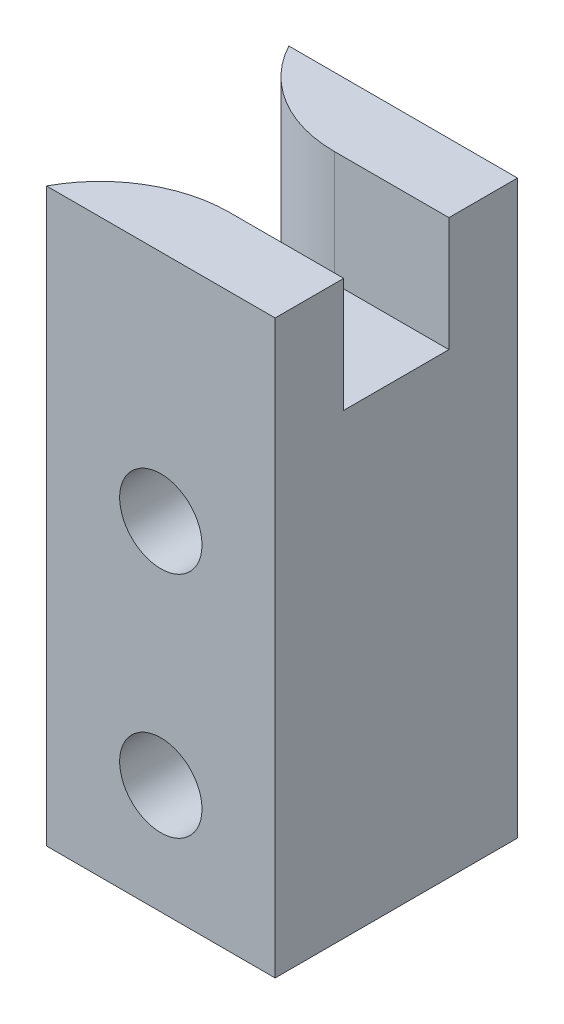
ISO-10303-21;
HEADER;
FILE_DESCRIPTION(('STEP AP214'),'2;1');
FILE_NAME('part.step','',(''),(''),'','','');
FILE_SCHEMA(('AUTOMOTIVE_DESIGN { 1 0 10303 214 1 1 1 1 }'));
ENDSEC;
DATA;
#1=APPLICATION_CONTEXT('core data for automotive mechanical design processes');
#2=APPLICATION_PROTOCOL_DEFINITION('international standard','automotive_design',2000,#1);
#3=PRODUCT_CONTEXT('',#1,'mechanical');
#4=PRODUCT('Part','Part','',(#3));
#5=PRODUCT_RELATED_PRODUCT_CATEGORY('part','',(#4));
#6=PRODUCT_DEFINITION_FORMATION('','',#4);
#7=PRODUCT_DEFINITION_CONTEXT('part definition',#1,'design');
#8=PRODUCT_DEFINITION('design','',#6,#7);
#9=PRODUCT_DEFINITION_SHAPE('','',#8);
#10=(LENGTH_UNIT() NAMED_UNIT(*) SI_UNIT(.MILLI.,.METRE.));
#11=(NAMED_UNIT(*) PLANE_ANGLE_UNIT() SI_UNIT($,.RADIAN.));
#12=(NAMED_UNIT(*) SI_UNIT($,.STERADIAN.) SOLID_ANGLE_UNIT());
#13=UNCERTAINTY_MEASURE_WITH_UNIT(LENGTH_MEASURE(1.E-05),#10,'distance_accuracy_value','');
#14=(GEOMETRIC_REPRESENTATION_CONTEXT(3) GLOBAL_UNCERTAINTY_ASSIGNED_CONTEXT((#13)) GLOBAL_UNIT_ASSIGNED_CONTEXT((#10,
#11,#12)) REPRESENTATION_CONTEXT('',''));
#15=CARTESIAN_POINT('',(0.,0.,0.));
#16=DIRECTION('',(0.,0.,1.));
#17=DIRECTION('',(1.,0.,0.));
#18=AXIS2_PLACEMENT_3D('',#15,#16,#17);
#19=CARTESIAN_POINT('',(0.,20.,0.));
#20=DIRECTION('',(0.,-1.,0.));
#21=DIRECTION('',(0.,0.,-1.));
#22=AXIS2_PLACEMENT_3D('',#19,#20,#21);
#23=PLANE('',#22);
#24=DIRECTION('',(-1.,0.,0.));
#25=VECTOR('',#24,1.);
#26=CARTESIAN_POINT('',(10.,20.,-3.));
#27=LINE('',#26,#25);
#28=CARTESIAN_POINT('',(10.,20.,-3.));
#29=VERTEX_POINT('',#28);
#30=CARTESIAN_POINT('',(5.,20.,-3.));
#31=VERTEX_POINT('',#30);
#32=EDGE_CURVE('E127',#29,#31,#27,.T.);
#33=ORIENTED_EDGE('',*,*,#32,.F.);
#34=DIRECTION('',(0.,0.,-1.));
#35=VECTOR('',#34,1.);
#36=CARTESIAN_POINT('',(10.,20.,0.));
#37=LINE('',#36,#35);
#38=CARTESIAN_POINT('',(10.,20.,-7.6));
#39=VERTEX_POINT('',#38);
#40=EDGE_CURVE('E183',#29,#39,#37,.T.);
#41=ORIENTED_EDGE('',*,*,#40,.T.);
#42=DIRECTION('',(1.,0.,0.));
#43=VECTOR('',#42,1.);
#44=CARTESIAN_POINT('',(5.,20.,-7.6));
#45=LINE('',#44,#43);
#46=CARTESIAN_POINT('',(5.,20.,-7.6));
#47=VERTEX_POINT('',#46);
#48=EDGE_CURVE('E145',#47,#39,#45,.T.);
#49=ORIENTED_EDGE('',*,*,#48,.F.);
#50=DIRECTION('',(0.,0.,1.));
#51=VECTOR('',#50,1.);
#52=CARTESIAN_POINT('',(5.,20.,-10.6));
#53=LINE('',#52,#51);
#54=EDGE_CURVE('E175',#47,#31,#53,.T.);
#55=ORIENTED_EDGE('',*,*,#54,.T.);
#56=EDGE_LOOP('',(#33,#41,#49,#55));
#57=FACE_BOUND('',#56,.T.);
#58=ADVANCED_FACE('F32',(#57),#23,.F.);
#59=CARTESIAN_POINT('',(0.,20.,0.));
#60=DIRECTION('',(1.,0.,0.));
#61=DIRECTION('',(0.,0.,-1.));
#62=AXIS2_PLACEMENT_3D('',#59,#60,#61);
#63=PLANE('',#62);
#64=DIRECTION('',(0.,-1.,0.));
#65=VECTOR('',#64,1.);
#66=CARTESIAN_POINT('',(0.,20.,0.));
#67=LINE('',#66,#65);
#68=CARTESIAN_POINT('',(0.,17.3166247903554,0.));
#69=VERTEX_POINT('',#68);
#70=CARTESIAN_POINT('',(0.,0.,0.));
#71=VERTEX_POINT('',#70);
#72=EDGE_CURVE('E11',#69,#71,#67,.T.);
#73=ORIENTED_EDGE('',*,*,#72,.F.);
#74=DIRECTION('',(0.,0.,1.));
#75=VECTOR('',#74,1.);
#76=CARTESIAN_POINT('',(0.,17.3166247903554,-10.6));
#77=LINE('',#76,#75);
#78=CARTESIAN_POINT('',(0.,17.3166247903654,-10.6));
#79=VERTEX_POINT('',#78);
#80=EDGE_CURVE('E178',#79,#69,#77,.T.);
#81=ORIENTED_EDGE('',*,*,#80,.F.);
#82=DIRECTION('',(0.,-1.,0.));
#83=VECTOR('',#82,1.);
#84=CARTESIAN_POINT('',(0.,20.,-10.6));
#85=LINE('',#84,#83);
#86=CARTESIAN_POINT('',(0.,0.,-10.6));
#87=VERTEX_POINT('',#86);
#88=EDGE_CURVE('E57',#79,#87,#85,.T.);
#89=ORIENTED_EDGE('',*,*,#88,.T.);
#90=DIRECTION('',(0.,0.,1.));
#91=VECTOR('',#90,1.);
#92=CARTESIAN_POINT('',(0.,0.,0.));
#93=LINE('',#92,#91);
#94=EDGE_CURVE('E180',#87,#71,#93,.T.);
#95=ORIENTED_EDGE('',*,*,#94,.T.);
#96=EDGE_LOOP('',(#73,#81,#89,#95));
#97=FACE_BOUND('',#96,.T.);
#98=ADVANCED_FACE('F34',(#97),#63,.F.);
#99=CARTESIAN_POINT('',(0.,20.,0.));
#100=DIRECTION('',(0.,0.,-1.));
#101=DIRECTION('',(-1.,0.,0.));
#102=AXIS2_PLACEMENT_3D('',#99,#100,#101);
#103=PLANE('',#102);
#104=CARTESIAN_POINT('',(5.,4.8,0.));
#105=DIRECTION('',(0.,0.,1.));
#106=DIRECTION('',(1.,0.,0.));
#107=AXIS2_PLACEMENT_3D('',#104,#105,#106);
#108=CIRCLE('',#107,1.8);
#109=CARTESIAN_POINT('',(6.8,4.8,0.));
#110=VERTEX_POINT('',#109);
#111=EDGE_CURVE('E203',#110,#110,#108,.T.);
#112=ORIENTED_EDGE('',*,*,#111,.F.);
#113=EDGE_LOOP('',(#112));
#114=FACE_BOUND('',#113,.T.);
#115=CARTESIAN_POINT('',(5.,14.8,0.));
#116=DIRECTION('',(0.,0.,1.));
#117=DIRECTION('',(1.,0.,0.));
#118=AXIS2_PLACEMENT_3D('',#115,#116,#117);
#119=CIRCLE('',#118,1.8);
#120=CARTESIAN_POINT('',(6.8,14.8,0.));
#121=VERTEX_POINT('',#120);
#122=EDGE_CURVE('E132',#121,#121,#119,.T.);
#123=ORIENTED_EDGE('',*,*,#122,.F.);
#124=EDGE_LOOP('',(#123));
#125=FACE_BOUND('',#124,.T.);
#126=DIRECTION('',(0.,-1.,0.));
#127=VECTOR('',#126,1.);
#128=CARTESIAN_POINT('',(10.,20.,0.));
#129=LINE('',#128,#127);
#130=CARTESIAN_POINT('',(10.,25.,0.));
#131=VERTEX_POINT('',#130);
#132=CARTESIAN_POINT('',(10.,0.,0.));
#133=VERTEX_POINT('',#132);
#134=EDGE_CURVE('E41',#131,#133,#129,.T.);
#135=ORIENTED_EDGE('',*,*,#134,.F.);
#136=DIRECTION('',(1.,0.,0.));
#137=VECTOR('',#136,1.);
#138=CARTESIAN_POINT('',(0.,25.,0.));
#139=LINE('',#138,#137);
#140=CARTESIAN_POINT('',(0.,25.,0.));
#141=VERTEX_POINT('',#140);
#142=EDGE_CURVE('E117',#141,#131,#139,.T.);
#143=ORIENTED_EDGE('',*,*,#142,.F.);
#144=DIRECTION('',(0.,1.,0.));
#145=VECTOR('',#144,1.);
#146=CARTESIAN_POINT('',(0.,-500000.,0.));
#147=LINE('',#146,#145);
#148=EDGE_CURVE('E105',#69,#141,#147,.T.);
#149=ORIENTED_EDGE('',*,*,#148,.F.);
#150=ORIENTED_EDGE('',*,*,#72,.T.);
#151=DIRECTION('',(1.,0.,0.));
#152=VECTOR('',#151,1.);
#153=CARTESIAN_POINT('',(0.,0.,0.));
#154=LINE('',#153,#152);
#155=EDGE_CURVE('E187',#71,#133,#154,.T.);
#156=ORIENTED_EDGE('',*,*,#155,.T.);
#157=EDGE_LOOP('',(#135,#143,#149,#150,#156));
#158=FACE_BOUND('',#157,.T.);
#159=ADVANCED_FACE('F118',(#114,#125,#158),#103,.F.);
#160=CARTESIAN_POINT('',(10.,20.,0.));
#161=DIRECTION('',(-1.,0.,0.));
#162=DIRECTION('',(0.,0.,1.));
#163=AXIS2_PLACEMENT_3D('',#160,#161,#162);
#164=PLANE('',#163);
#165=DIRECTION('',(0.,0.,-1.));
#166=VECTOR('',#165,1.);
#167=CARTESIAN_POINT('',(10.,0.,0.));
#168=LINE('',#167,#166);
#169=CARTESIAN_POINT('',(10.,0.,-10.6));
#170=VERTEX_POINT('',#169);
#171=EDGE_CURVE('E189',#133,#170,#168,.T.);
#172=ORIENTED_EDGE('',*,*,#171,.T.);
#173=DIRECTION('',(0.,-1.,0.));
#174=VECTOR('',#173,1.);
#175=CARTESIAN_POINT('',(10.,20.,-10.6));
#176=LINE('',#175,#174);
#177=CARTESIAN_POINT('',(10.,25.,-10.6));
#178=VERTEX_POINT('',#177);
#179=EDGE_CURVE('E193',#178,#170,#176,.T.);
#180=ORIENTED_EDGE('',*,*,#179,.F.);
#181=DIRECTION('',(0.,0.,-1.));
#182=VECTOR('',#181,1.);
#183=CARTESIAN_POINT('',(10.,25.,-7.6));
#184=LINE('',#183,#182);
#185=CARTESIAN_POINT('',(10.,25.,-7.6));
#186=VERTEX_POINT('',#185);
#187=EDGE_CURVE('E146',#186,#178,#184,.T.);
#188=ORIENTED_EDGE('',*,*,#187,.F.);
#189=DIRECTION('',(0.,-1.,0.));
#190=VECTOR('',#189,1.);
#191=CARTESIAN_POINT('',(10.,25.,-7.6));
#192=LINE('',#191,#190);
#193=EDGE_CURVE('E263',#186,#39,#192,.T.);
#194=ORIENTED_EDGE('',*,*,#193,.T.);
#195=ORIENTED_EDGE('',*,*,#40,.F.);
#196=DIRECTION('',(0.,-1.,0.));
#197=VECTOR('',#196,1.);
#198=CARTESIAN_POINT('',(10.,25.,-3.));
#199=LINE('',#198,#197);
#200=CARTESIAN_POINT('',(10.,25.,-3.));
#201=VERTEX_POINT('',#200);
#202=EDGE_CURVE('E114',#201,#29,#199,.T.);
#203=ORIENTED_EDGE('',*,*,#202,.F.);
#204=DIRECTION('',(0.,0.,-1.));
#205=VECTOR('',#204,1.);
#206=CARTESIAN_POINT('',(10.,25.,0.));
#207=LINE('',#206,#205);
#208=EDGE_CURVE('E122',#131,#201,#207,.T.);
#209=ORIENTED_EDGE('',*,*,#208,.F.);
#210=ORIENTED_EDGE('',*,*,#134,.T.);
#211=EDGE_LOOP('',(#172,#180,#188,#194,#195,#203,#209,#210));
#212=FACE_BOUND('',#211,.T.);
#213=ADVANCED_FACE('F214',(#212),#164,.F.);
#214=CARTESIAN_POINT('',(0.,20.,-10.6));
#215=DIRECTION('',(0.,0.,1.));
#216=DIRECTION('',(1.,0.,0.));
#217=AXIS2_PLACEMENT_3D('',#214,#215,#216);
#218=PLANE('',#217);
#219=CARTESIAN_POINT('',(5.,4.8,-10.6));
#220=DIRECTION('',(0.,0.,1.));
#221=DIRECTION('',(1.,0.,0.));
#222=AXIS2_PLACEMENT_3D('',#219,#220,#221);
#223=CIRCLE('',#222,1.8);
#224=CARTESIAN_POINT('',(6.8,4.8,-10.6));
#225=VERTEX_POINT('',#224);
#226=EDGE_CURVE('E36',#225,#225,#223,.T.);
#227=ORIENTED_EDGE('',*,*,#226,.T.);
#228=EDGE_LOOP('',(#227));
#229=FACE_BOUND('',#228,.T.);
#230=CARTESIAN_POINT('',(5.,14.8,-10.6));
#231=DIRECTION('',(0.,0.,1.));
#232=DIRECTION('',(1.,0.,0.));
#233=AXIS2_PLACEMENT_3D('',#230,#231,#232);
#234=CIRCLE('',#233,1.8);
#235=CARTESIAN_POINT('',(6.8,14.8,-10.6));
#236=VERTEX_POINT('',#235);
#237=EDGE_CURVE('E129',#236,#236,#234,.T.);
#238=ORIENTED_EDGE('',*,*,#237,.T.);
#239=EDGE_LOOP('',(#238));
#240=FACE_BOUND('',#239,.T.);
#241=ORIENTED_EDGE('',*,*,#88,.F.);
#242=DIRECTION('',(0.,1.,0.));
#243=VECTOR('',#242,1.);
#244=CARTESIAN_POINT('',(0.,-500000.,-10.6));
#245=LINE('',#244,#243);
#246=CARTESIAN_POINT('',(0.,25.,-10.6));
#247=VERTEX_POINT('',#246);
#248=EDGE_CURVE('E176',#79,#247,#245,.T.);
#249=ORIENTED_EDGE('',*,*,#248,.T.);
#250=DIRECTION('',(-1.,0.,0.));
#251=VECTOR('',#250,1.);
#252=CARTESIAN_POINT('',(10.,25.,-10.6));
#253=LINE('',#252,#251);
#254=EDGE_CURVE('E258',#178,#247,#253,.T.);
#255=ORIENTED_EDGE('',*,*,#254,.F.);
#256=ORIENTED_EDGE('',*,*,#179,.T.);
#257=DIRECTION('',(-1.,0.,0.));
#258=VECTOR('',#257,1.);
#259=CARTESIAN_POINT('',(0.,0.,-10.6));
#260=LINE('',#259,#258);
#261=EDGE_CURVE('E185',#170,#87,#260,.T.);
#262=ORIENTED_EDGE('',*,*,#261,.T.);
#263=EDGE_LOOP('',(#241,#249,#255,#256,#262));
#264=FACE_BOUND('',#263,.T.);
#265=ADVANCED_FACE('F219',(#229,#240,#264),#218,.F.);
#266=CARTESIAN_POINT('',(0.,0.,0.));
#267=DIRECTION('',(0.,-1.,0.));
#268=DIRECTION('',(0.,0.,-1.));
#269=AXIS2_PLACEMENT_3D('',#266,#267,#268);
#270=PLANE('',#269);
#271=ORIENTED_EDGE('',*,*,#94,.F.);
#272=ORIENTED_EDGE('',*,*,#261,.F.);
#273=ORIENTED_EDGE('',*,*,#171,.F.);
#274=ORIENTED_EDGE('',*,*,#155,.F.);
#275=EDGE_LOOP('',(#271,#272,#273,#274));
#276=FACE_BOUND('',#275,.T.);
#277=ADVANCED_FACE('F229',(#276),#270,.T.);
#278=CARTESIAN_POINT('',(5.,14.,-10.6));
#279=DIRECTION('',(0.,0.,1.));
#280=DIRECTION('',(1.,0.,0.));
#281=AXIS2_PLACEMENT_3D('',#278,#279,#280);
#282=CYLINDRICAL_SURFACE('',#281,6.);
#283=ORIENTED_EDGE('',*,*,#80,.T.);
#284=CARTESIAN_POINT('',(5.,20.00000000001,-3.));
#285=CARTESIAN_POINT('',(4.87015235626989,20.0000330661666,-3.00003261085963));
#286=CARTESIAN_POINT('',(4.74032619025574,19.9957863740364,-2.99553844070096));
#287=CARTESIAN_POINT('',(4.481916412341,19.9789826677779,-2.9777430172347));
#288=CARTESIAN_POINT('',(4.35333192970877,19.9664319829146,-2.9644484715291));
#289=CARTESIAN_POINT('',(4.09946769219286,19.9334071592623,-2.92944474894869));
#290=CARTESIAN_POINT('',(3.97416931430734,19.9130000125325,-2.90780671461202));
#291=CARTESIAN_POINT('',(3.72668749971539,19.8646882415482,-2.85653471097632));
#292=CARTESIAN_POINT('',(3.60450449586079,19.8367825815942,-2.82689963711863));
#293=CARTESIAN_POINT('',(3.36441124316187,19.7740971582998,-2.76025112051441));
#294=CARTESIAN_POINT('',(3.2464891398449,19.73933853908,-2.72326037003099));
#295=CARTESIAN_POINT('',(3.01509887307057,19.6634802276082,-2.64241187053578));
#296=CARTESIAN_POINT('',(2.90163248385,19.6223780408712,-2.59855142004663));
#297=CARTESIAN_POINT('',(2.56832273676689,19.4903611979142,-2.45742207665999));
#298=CARTESIAN_POINT('',(2.35584061656059,19.3908093466814,-2.35068261466156));
#299=CARTESIAN_POINT('',(1.87091902420642,19.1295680215857,-2.0690933054662));
#300=CARTESIAN_POINT('',(1.60909563349888,18.9590494723722,-1.88417430078589));
#301=CARTESIAN_POINT('',(1.24931097182161,18.685637268043,-1.58397953746816));
#302=CARTESIAN_POINT('',(1.1347049699989,18.5913824333791,-1.47991205386422));
#303=CARTESIAN_POINT('',(0.916290767882854,18.3982411001985,-1.26498311349412));
#304=CARTESIAN_POINT('',(0.81247829028914,18.2993564591041,-1.15412437588407));
#305=CARTESIAN_POINT('',(0.643810787191006,18.1271872265044,-0.959106804179187));
#306=CARTESIAN_POINT('',(0.576343961618461,18.0547276806266,-0.876448692504962));
#307=CARTESIAN_POINT('',(0.446674534533158,17.9085507323813,-0.708183536856322));
#308=CARTESIAN_POINT('',(0.38447131210669,17.8348334796137,-0.62257684238845));
#309=CARTESIAN_POINT('',(0.265659286766842,17.6871305403636,-0.449118083530197));
#310=CARTESIAN_POINT('',(0.209014039334296,17.6131504367892,-0.361286173823181));
#311=CARTESIAN_POINT('',(0.100753043308006,17.4649415399638,-0.182780467714627));
#312=CARTESIAN_POINT('',(0.0491372195832869,17.390712750445,-0.0921067137921234));
#313=CARTESIAN_POINT('',(2.17146761784947E-12,17.3166247903587,-4.06910701561502E-12));
#314=B_SPLINE_CURVE_WITH_KNOTS('',3,(#284,#285,#286,#287,#288,#289,#290,#291,#292,#293,#294,
#295,#296,#297,#298,#299,#300,#301,#302,#303,#304,#305,#306,#307,#308,#309,#310,#311,#312,#313),
.UNSPECIFIED.,.F.,.F.,(4,2,2,2,2,2,2,2,2,2,2,2,2,2,4),(0.,0.389361918380168,0.778427408248754,
1.1642462987871,1.55011850629573,1.93481826744754,2.31966969157204,3.09023843035518,
4.17320625887817,4.71657296093489,5.25972350812743,5.6465164918006,6.03326378417859,
6.41727667517165,6.80128382879022),.UNSPECIFIED.);
#315=EDGE_CURVE('E111',#31,#69,#314,.T.);
#316=ORIENTED_EDGE('',*,*,#315,.F.);
#317=ORIENTED_EDGE('',*,*,#54,.F.);
#318=CARTESIAN_POINT('',(0.,17.3166247903654,-10.6));
#319=CARTESIAN_POINT('',(0.0459467484768606,17.3859007218073,-10.513869620564));
#320=CARTESIAN_POINT('',(0.0940614028035315,17.4553026859915,-10.4289961405136));
#321=CARTESIAN_POINT('',(0.194690603907055,17.5939286497214,-10.2617258868113));
#322=CARTESIAN_POINT('',(0.247205748109365,17.6631526237835,-10.1793294515214));
#323=CARTESIAN_POINT('',(0.356842158935198,17.8011681327338,-10.016770357809));
#324=CARTESIAN_POINT('',(0.413976016468918,17.869957893967,-9.93661466595195));
#325=CARTESIAN_POINT('',(0.532782373454544,18.0065144351538,-9.77885530742983));
#326=CARTESIAN_POINT('',(0.594454700298086,18.0742812538943,-9.70125154387136));
#327=CARTESIAN_POINT('',(0.787942817130887,18.2771216390503,-9.47057473660021));
#328=CARTESIAN_POINT('',(0.926938789589195,18.4100858912953,-9.32156279173789));
#329=CARTESIAN_POINT('',(1.22428705294362,18.6671793526093,-9.03612446133605));
#330=CARTESIAN_POINT('',(1.3826132485248,18.791320122458,-8.89968153538004));
#331=CARTESIAN_POINT('',(1.65296939297685,18.981263447347,-8.69227278359254));
#332=CARTESIAN_POINT('',(1.75878793335749,19.0508433297455,-8.61662256903542));
#333=CARTESIAN_POINT('',(1.97770732830264,19.1848055697571,-8.47144989771539));
#334=CARTESIAN_POINT('',(2.09080804612718,19.249188024913,-8.40192732594964));
#335=CARTESIAN_POINT('',(2.32367990893002,19.3716431785101,-8.27004200883598));
#336=CARTESIAN_POINT('',(2.4434235083968,19.4297393599987,-8.20765256367483));
#337=CARTESIAN_POINT('',(2.68965490720068,19.5389923029986,-8.09056871656174));
#338=CARTESIAN_POINT('',(2.81614146618794,19.5901503346706,-8.0358729060749));
#339=CARTESIAN_POINT('',(3.05569414399948,19.677444516124,-7.94269157767961));
#340=CARTESIAN_POINT('',(3.16789258088995,19.7146823323807,-7.90300555972176));
#341=CARTESIAN_POINT('',(3.39628042142813,19.7829301521463,-7.83034919545077));
#342=CARTESIAN_POINT('',(3.51246907255999,19.8139413224694,-7.79737759090394));
#343=CARTESIAN_POINT('',(3.74812528987171,19.8691942484552,-7.73867875160158));
#344=CARTESIAN_POINT('',(3.86758970181162,19.8934422812194,-7.71294479914432));
#345=CARTESIAN_POINT('',(4.10909383986491,19.9347524463433,-7.66912694826405));
#346=CARTESIAN_POINT('',(4.23113239365015,19.9518177787236,-7.651039643108));
#347=CARTESIAN_POINT('',(4.46084904433361,19.9766922691532,-7.62468308418775));
#348=CARTESIAN_POINT('',(4.56831710322367,19.9854202989309,-7.61543894182615));
#349=CARTESIAN_POINT('',(4.78385211937478,19.9970800758699,-7.60309171182461));
#350=CARTESIAN_POINT('',(4.89191867935391,20.0000152917308,-7.59998494916012));
#351=CARTESIAN_POINT('',(4.99999999999803,20.,-7.6));
#352=B_SPLINE_CURVE_WITH_KNOTS('',3,(#318,#319,#320,#321,#322,#323,#324,#325,#326,#327,#328,
#329,#330,#331,#332,#333,#334,#335,#336,#337,#338,#339,#340,#341,#342,#343,#344,#345,#346,#347,
#348,#349,#350,#351),.UNSPECIFIED.,.F.,.F.,(4,2,2,2,2,2,2,2,2,2,2,2,2,2,2,2,4),(0.,
0.359081891833932,0.71821261307634,1.07835768843631,1.43848907372742,2.16725772694408,
2.89505321882479,3.33726789565712,3.77947427129103,4.21996713657415,4.66037925206832,
5.03410913698369,5.4077689229788,5.78108073953553,6.15422606255442,6.4785539502475,
6.80268757349413),.UNSPECIFIED.);
#353=EDGE_CURVE('E169',#79,#47,#352,.T.);
#354=ORIENTED_EDGE('',*,*,#353,.F.);
#355=EDGE_LOOP('',(#283,#316,#317,#354));
#356=FACE_BOUND('',#355,.T.);
#357=ADVANCED_FACE('F164',(#356),#282,.T.);
#358=CARTESIAN_POINT('',(5.,-500000.,-13.2666666666667));
#359=DIRECTION('',(0.,1.,0.));
#360=DIRECTION('',(0.,0.,1.));
#361=AXIS2_PLACEMENT_3D('',#358,#359,#360);
#362=CYLINDRICAL_SURFACE('',#361,5.66666666666667);
#363=ORIENTED_EDGE('',*,*,#248,.F.);
#364=ORIENTED_EDGE('',*,*,#353,.T.);
#365=DIRECTION('',(0.,-1.,0.));
#366=VECTOR('',#365,1.);
#367=CARTESIAN_POINT('',(5.,25.,-7.6));
#368=LINE('',#367,#366);
#369=CARTESIAN_POINT('',(5.,25.,-7.6));
#370=VERTEX_POINT('',#369);
#371=EDGE_CURVE('E264',#370,#47,#368,.T.);
#372=ORIENTED_EDGE('',*,*,#371,.F.);
#373=CARTESIAN_POINT('',(5.,25.,-13.2666666666667));
#374=DIRECTION('',(0.,1.,0.));
#375=DIRECTION('',(0.,0.,1.));
#376=AXIS2_PLACEMENT_3D('',#373,#374,#375);
#377=CIRCLE('',#376,5.66666666666667);
#378=EDGE_CURVE('E268',#247,#370,#377,.T.);
#379=ORIENTED_EDGE('',*,*,#378,.F.);
#380=EDGE_LOOP('',(#363,#364,#372,#379));
#381=FACE_BOUND('',#380,.T.);
#382=ADVANCED_FACE('F159',(#381),#362,.T.);
#383=CARTESIAN_POINT('',(5.,25.,-7.6));
#384=DIRECTION('',(0.,0.,-1.));
#385=DIRECTION('',(-1.,0.,0.));
#386=AXIS2_PLACEMENT_3D('',#383,#384,#385);
#387=PLANE('',#386);
#388=ORIENTED_EDGE('',*,*,#48,.T.);
#389=ORIENTED_EDGE('',*,*,#193,.F.);
#390=DIRECTION('',(1.,0.,0.));
#391=VECTOR('',#390,1.);
#392=CARTESIAN_POINT('',(5.,25.,-7.6));
#393=LINE('',#392,#391);
#394=EDGE_CURVE('E261',#370,#186,#393,.T.);
#395=ORIENTED_EDGE('',*,*,#394,.F.);
#396=ORIENTED_EDGE('',*,*,#371,.T.);
#397=EDGE_LOOP('',(#388,#389,#395,#396));
#398=FACE_BOUND('',#397,.T.);
#399=ADVANCED_FACE('F155',(#398),#387,.F.);
#400=CARTESIAN_POINT('',(5.,25.,-13.2666666666667));
#401=DIRECTION('',(0.,1.,0.));
#402=DIRECTION('',(0.,0.,1.));
#403=AXIS2_PLACEMENT_3D('',#400,#401,#402);
#404=PLANE('',#403);
#405=ORIENTED_EDGE('',*,*,#187,.T.);
#406=ORIENTED_EDGE('',*,*,#254,.T.);
#407=ORIENTED_EDGE('',*,*,#378,.T.);
#408=ORIENTED_EDGE('',*,*,#394,.T.);
#409=EDGE_LOOP('',(#405,#406,#407,#408));
#410=FACE_BOUND('',#409,.T.);
#411=ADVANCED_FACE('F152',(#410),#404,.T.);
#412=CARTESIAN_POINT('',(5.,-500000.,2.66666666666667));
#413=DIRECTION('',(0.,1.,0.));
#414=DIRECTION('',(0.,0.,1.));
#415=AXIS2_PLACEMENT_3D('',#412,#413,#414);
#416=CYLINDRICAL_SURFACE('',#415,5.66666666666667);
#417=ORIENTED_EDGE('',*,*,#148,.T.);
#418=CARTESIAN_POINT('',(5.,25.,2.66666666666667));
#419=DIRECTION('',(0.,1.,0.));
#420=DIRECTION('',(0.,0.,1.));
#421=AXIS2_PLACEMENT_3D('',#418,#419,#420);
#422=CIRCLE('',#421,5.66666666666667);
#423=CARTESIAN_POINT('',(5.,25.,-3.));
#424=VERTEX_POINT('',#423);
#425=EDGE_CURVE('E109',#424,#141,#422,.T.);
#426=ORIENTED_EDGE('',*,*,#425,.F.);
#427=DIRECTION('',(0.,-1.,0.));
#428=VECTOR('',#427,1.);
#429=CARTESIAN_POINT('',(5.,25.,-3.));
#430=LINE('',#429,#428);
#431=EDGE_CURVE('E49',#424,#31,#430,.T.);
#432=ORIENTED_EDGE('',*,*,#431,.T.);
#433=ORIENTED_EDGE('',*,*,#315,.T.);
#434=EDGE_LOOP('',(#417,#426,#432,#433));
#435=FACE_BOUND('',#434,.T.);
#436=ADVANCED_FACE('F107',(#435),#416,.T.);
#437=CARTESIAN_POINT('',(10.,25.,-3.));
#438=DIRECTION('',(0.,0.,1.));
#439=DIRECTION('',(1.,0.,0.));
#440=AXIS2_PLACEMENT_3D('',#437,#438,#439);
#441=PLANE('',#440);
#442=ORIENTED_EDGE('',*,*,#32,.T.);
#443=ORIENTED_EDGE('',*,*,#431,.F.);
#444=DIRECTION('',(-1.,0.,0.));
#445=VECTOR('',#444,1.);
#446=CARTESIAN_POINT('',(10.,25.,-3.));
#447=LINE('',#446,#445);
#448=EDGE_CURVE('E126',#201,#424,#447,.T.);
#449=ORIENTED_EDGE('',*,*,#448,.F.);
#450=ORIENTED_EDGE('',*,*,#202,.T.);
#451=EDGE_LOOP('',(#442,#443,#449,#450));
#452=FACE_BOUND('',#451,.T.);
#453=ADVANCED_FACE('F248',(#452),#441,.F.);
#454=CARTESIAN_POINT('',(5.,25.,2.66666666666667));
#455=DIRECTION('',(0.,1.,0.));
#456=DIRECTION('',(0.,0.,1.));
#457=AXIS2_PLACEMENT_3D('',#454,#455,#456);
#458=PLANE('',#457);
#459=ORIENTED_EDGE('',*,*,#425,.T.);
#460=ORIENTED_EDGE('',*,*,#142,.T.);
#461=ORIENTED_EDGE('',*,*,#208,.T.);
#462=ORIENTED_EDGE('',*,*,#448,.T.);
#463=EDGE_LOOP('',(#459,#460,#461,#462));
#464=FACE_BOUND('',#463,.T.);
#465=ADVANCED_FACE('F124',(#464),#458,.T.);
#466=CARTESIAN_POINT('',(5.,14.8,-11.1657489857611));
#467=DIRECTION('',(0.,0.,1.));
#468=DIRECTION('',(1.,0.,0.));
#469=AXIS2_PLACEMENT_3D('',#466,#467,#468);
#470=CYLINDRICAL_SURFACE('',#469,1.8);
#471=CARTESIAN_POINT('',(6.8,14.8,0.));
#472=CARTESIAN_POINT('',(6.8,14.8,-0.110416666666667));
#473=CARTESIAN_POINT('',(6.8,14.8,-0.220833333333333));
#474=CARTESIAN_POINT('',(6.8,14.8,-0.441666666666667));
#475=CARTESIAN_POINT('',(6.8,14.8,-0.552083333333333));
#476=CARTESIAN_POINT('',(6.8,14.8,-0.772916666666667));
#477=CARTESIAN_POINT('',(6.8,14.8,-0.883333333333333));
#478=CARTESIAN_POINT('',(6.8,14.8,-1.10416666666667));
#479=CARTESIAN_POINT('',(6.8,14.8,-1.21458333333333));
#480=CARTESIAN_POINT('',(6.8,14.8,-1.43541666666667));
#481=CARTESIAN_POINT('',(6.8,14.8,-1.54583333333333));
#482=CARTESIAN_POINT('',(6.8,14.8,-1.76666666666667));
#483=CARTESIAN_POINT('',(6.8,14.8,-1.87708333333333));
#484=CARTESIAN_POINT('',(6.8,14.8,-2.09791666666667));
#485=CARTESIAN_POINT('',(6.8,14.8,-2.20833333333333));
#486=CARTESIAN_POINT('',(6.8,14.8,-2.42916666666667));
#487=CARTESIAN_POINT('',(6.8,14.8,-2.53958333333333));
#488=CARTESIAN_POINT('',(6.8,14.8,-2.76041666666667));
#489=CARTESIAN_POINT('',(6.8,14.8,-2.87083333333333));
#490=CARTESIAN_POINT('',(6.8,14.8,-3.09166666666667));
#491=CARTESIAN_POINT('',(6.8,14.8,-3.20208333333333));
#492=CARTESIAN_POINT('',(6.8,14.8,-3.42291666666667));
#493=CARTESIAN_POINT('',(6.8,14.8,-3.53333333333333));
#494=CARTESIAN_POINT('',(6.8,14.8,-3.75416666666667));
#495=CARTESIAN_POINT('',(6.8,14.8,-3.86458333333333));
#496=CARTESIAN_POINT('',(6.8,14.8,-4.08541666666667));
#497=CARTESIAN_POINT('',(6.8,14.8,-4.19583333333333));
#498=CARTESIAN_POINT('',(6.8,14.8,-4.41666666666667));
#499=CARTESIAN_POINT('',(6.8,14.8,-4.52708333333333));
#500=CARTESIAN_POINT('',(6.8,14.8,-4.74791666666667));
#501=CARTESIAN_POINT('',(6.8,14.8,-4.85833333333333));
#502=CARTESIAN_POINT('',(6.8,14.8,-5.07916666666667));
#503=CARTESIAN_POINT('',(6.8,14.8,-5.18958333333333));
#504=CARTESIAN_POINT('',(6.8,14.8,-5.41041666666667));
#505=CARTESIAN_POINT('',(6.8,14.8,-5.52083333333333));
#506=CARTESIAN_POINT('',(6.8,14.8,-5.74166666666667));
#507=CARTESIAN_POINT('',(6.8,14.8,-5.85208333333333));
#508=CARTESIAN_POINT('',(6.8,14.8,-6.07291666666667));
#509=CARTESIAN_POINT('',(6.8,14.8,-6.18333333333333));
#510=CARTESIAN_POINT('',(6.8,14.8,-6.40416666666667));
#511=CARTESIAN_POINT('',(6.8,14.8,-6.51458333333333));
#512=CARTESIAN_POINT('',(6.8,14.8,-6.73541666666667));
#513=CARTESIAN_POINT('',(6.8,14.8,-6.84583333333333));
#514=CARTESIAN_POINT('',(6.8,14.8,-7.06666666666667));
#515=CARTESIAN_POINT('',(6.8,14.8,-7.17708333333333));
#516=CARTESIAN_POINT('',(6.8,14.8,-7.39791666666667));
#517=CARTESIAN_POINT('',(6.8,14.8,-7.50833333333333));
#518=CARTESIAN_POINT('',(6.8,14.8,-7.72916666666667));
#519=CARTESIAN_POINT('',(6.8,14.8,-7.83958333333333));
#520=CARTESIAN_POINT('',(6.8,14.8,-8.06041666666667));
#521=CARTESIAN_POINT('',(6.8,14.8,-8.17083333333333));
#522=CARTESIAN_POINT('',(6.8,14.8,-8.39166666666667));
#523=CARTESIAN_POINT('',(6.8,14.8,-8.50208333333333));
#524=CARTESIAN_POINT('',(6.8,14.8,-8.72291666666667));
#525=CARTESIAN_POINT('',(6.8,14.8,-8.83333333333333));
#526=CARTESIAN_POINT('',(6.8,14.8,-9.05416666666667));
#527=CARTESIAN_POINT('',(6.8,14.8,-9.16458333333333));
#528=CARTESIAN_POINT('',(6.8,14.8,-9.38541666666667));
#529=CARTESIAN_POINT('',(6.8,14.8,-9.49583333333333));
#530=CARTESIAN_POINT('',(6.8,14.8,-9.71666666666667));
#531=CARTESIAN_POINT('',(6.8,14.8,-9.82708333333333));
#532=CARTESIAN_POINT('',(6.8,14.8,-10.0479166666667));
#533=CARTESIAN_POINT('',(6.8,14.8,-10.1583333333333));
#534=CARTESIAN_POINT('',(6.8,14.8,-10.3791666666667));
#535=CARTESIAN_POINT('',(6.8,14.8,-10.4895833333333));
#536=CARTESIAN_POINT('',(6.8,14.8,-10.6));
#537=B_SPLINE_CURVE_WITH_KNOTS('',3,(#471,#472,#473,#474,#475,#476,#477,#478,#479,#480,#481,
#482,#483,#484,#485,#486,#487,#488,#489,#490,#491,#492,#493,#494,#495,#496,#497,#498,#499,#500,
#501,#502,#503,#504,#505,#506,#507,#508,#509,#510,#511,#512,#513,#514,#515,#516,#517,#518,#519,
#520,#521,#522,#523,#524,#525,#526,#527,#528,#529,#530,#531,#532,#533,#534,#535,#536),
.UNSPECIFIED.,.F.,.F.,(4,2,2,2,2,2,2,2,2,2,2,2,2,2,2,2,2,2,2,2,2,2,2,2,2,2,2,2,2,2,2,2,4),(0.,
0.33125,0.6625,0.99375,1.325,1.65625,1.9875,2.31875,2.65,2.98125,3.3125,3.64375,3.975,4.30625,
4.6375,4.96875,5.3,5.63125,5.9625,6.29375,6.625,6.95625,7.2875,7.61875,7.95,8.28125,8.6125,
8.94375,9.275,9.60625,9.9375,10.26875,10.6),.UNSPECIFIED.);
#538=EDGE_CURVE('BSEAM304',#121,#236,#537,.T.);
#539=ORIENTED_EDGE('',*,*,#122,.T.);
#540=ORIENTED_EDGE('',*,*,#237,.F.);
#541=ORIENTED_EDGE('',*,*,#538,.T.);
#542=ORIENTED_EDGE('',*,*,#538,.F.);
#543=EDGE_LOOP('',(#539,#541,#540,#542));
#544=FACE_BOUND('',#543,.T.);
#545=ADVANCED_FACE('F304',(#544),#470,.F.);
#546=CARTESIAN_POINT('',(5.,4.8,-11.1657489857611));
#547=DIRECTION('',(0.,0.,1.));
#548=DIRECTION('',(1.,0.,0.));
#549=AXIS2_PLACEMENT_3D('',#546,#547,#548);
#550=CYLINDRICAL_SURFACE('',#549,1.8);
#551=CARTESIAN_POINT('',(6.8,4.8,0.));
#552=CARTESIAN_POINT('',(6.8,4.8,-0.110416666666667));
#553=CARTESIAN_POINT('',(6.8,4.8,-0.220833333333333));
#554=CARTESIAN_POINT('',(6.8,4.8,-0.441666666666667));
#555=CARTESIAN_POINT('',(6.8,4.8,-0.552083333333333));
#556=CARTESIAN_POINT('',(6.8,4.8,-0.772916666666667));
#557=CARTESIAN_POINT('',(6.8,4.8,-0.883333333333333));
#558=CARTESIAN_POINT('',(6.8,4.8,-1.10416666666667));
#559=CARTESIAN_POINT('',(6.8,4.8,-1.21458333333333));
#560=CARTESIAN_POINT('',(6.8,4.8,-1.43541666666667));
#561=CARTESIAN_POINT('',(6.8,4.8,-1.54583333333333));
#562=CARTESIAN_POINT('',(6.8,4.8,-1.76666666666667));
#563=CARTESIAN_POINT('',(6.8,4.8,-1.87708333333333));
#564=CARTESIAN_POINT('',(6.8,4.8,-2.09791666666667));
#565=CARTESIAN_POINT('',(6.8,4.8,-2.20833333333333));
#566=CARTESIAN_POINT('',(6.8,4.8,-2.42916666666667));
#567=CARTESIAN_POINT('',(6.8,4.8,-2.53958333333333));
#568=CARTESIAN_POINT('',(6.8,4.8,-2.76041666666667));
#569=CARTESIAN_POINT('',(6.8,4.8,-2.87083333333333));
#570=CARTESIAN_POINT('',(6.8,4.8,-3.09166666666667));
#571=CARTESIAN_POINT('',(6.8,4.8,-3.20208333333333));
#572=CARTESIAN_POINT('',(6.8,4.8,-3.42291666666667));
#573=CARTESIAN_POINT('',(6.8,4.8,-3.53333333333333));
#574=CARTESIAN_POINT('',(6.8,4.8,-3.75416666666667));
#575=CARTESIAN_POINT('',(6.8,4.8,-3.86458333333333));
#576=CARTESIAN_POINT('',(6.8,4.8,-4.08541666666667));
#577=CARTESIAN_POINT('',(6.8,4.8,-4.19583333333333));
#578=CARTESIAN_POINT('',(6.8,4.8,-4.41666666666667));
#579=CARTESIAN_POINT('',(6.8,4.8,-4.52708333333333));
#580=CARTESIAN_POINT('',(6.8,4.8,-4.74791666666667));
#581=CARTESIAN_POINT('',(6.8,4.8,-4.85833333333333));
#582=CARTESIAN_POINT('',(6.8,4.8,-5.07916666666667));
#583=CARTESIAN_POINT('',(6.8,4.8,-5.18958333333333));
#584=CARTESIAN_POINT('',(6.8,4.8,-5.41041666666667));
#585=CARTESIAN_POINT('',(6.8,4.8,-5.52083333333333));
#586=CARTESIAN_POINT('',(6.8,4.8,-5.74166666666667));
#587=CARTESIAN_POINT('',(6.8,4.8,-5.85208333333333));
#588=CARTESIAN_POINT('',(6.8,4.8,-6.07291666666667));
#589=CARTESIAN_POINT('',(6.8,4.8,-6.18333333333333));
#590=CARTESIAN_POINT('',(6.8,4.8,-6.40416666666667));
#591=CARTESIAN_POINT('',(6.8,4.8,-6.51458333333333));
#592=CARTESIAN_POINT('',(6.8,4.8,-6.73541666666667));
#593=CARTESIAN_POINT('',(6.8,4.8,-6.84583333333333));
#594=CARTESIAN_POINT('',(6.8,4.8,-7.06666666666667));
#595=CARTESIAN_POINT('',(6.8,4.8,-7.17708333333333));
#596=CARTESIAN_POINT('',(6.8,4.8,-7.39791666666667));
#597=CARTESIAN_POINT('',(6.8,4.8,-7.50833333333333));
#598=CARTESIAN_POINT('',(6.8,4.8,-7.72916666666667));
#599=CARTESIAN_POINT('',(6.8,4.8,-7.83958333333333));
#600=CARTESIAN_POINT('',(6.8,4.8,-8.06041666666667));
#601=CARTESIAN_POINT('',(6.8,4.8,-8.17083333333333));
#602=CARTESIAN_POINT('',(6.8,4.8,-8.39166666666667));
#603=CARTESIAN_POINT('',(6.8,4.8,-8.50208333333333));
#604=CARTESIAN_POINT('',(6.8,4.8,-8.72291666666667));
#605=CARTESIAN_POINT('',(6.8,4.8,-8.83333333333333));
#606=CARTESIAN_POINT('',(6.8,4.8,-9.05416666666667));
#607=CARTESIAN_POINT('',(6.8,4.8,-9.16458333333333));
#608=CARTESIAN_POINT('',(6.8,4.8,-9.38541666666667));
#609=CARTESIAN_POINT('',(6.8,4.8,-9.49583333333333));
#610=CARTESIAN_POINT('',(6.8,4.8,-9.71666666666667));
#611=CARTESIAN_POINT('',(6.8,4.8,-9.82708333333333));
#612=CARTESIAN_POINT('',(6.8,4.8,-10.0479166666667));
#613=CARTESIAN_POINT('',(6.8,4.8,-10.1583333333333));
#614=CARTESIAN_POINT('',(6.8,4.8,-10.3791666666667));
#615=CARTESIAN_POINT('',(6.8,4.8,-10.4895833333333));
#616=CARTESIAN_POINT('',(6.8,4.8,-10.6));
#617=B_SPLINE_CURVE_WITH_KNOTS('',3,(#551,#552,#553,#554,#555,#556,#557,#558,#559,#560,#561,
#562,#563,#564,#565,#566,#567,#568,#569,#570,#571,#572,#573,#574,#575,#576,#577,#578,#579,#580,
#581,#582,#583,#584,#585,#586,#587,#588,#589,#590,#591,#592,#593,#594,#595,#596,#597,#598,#599,
#600,#601,#602,#603,#604,#605,#606,#607,#608,#609,#610,#611,#612,#613,#614,#615,#616),
.UNSPECIFIED.,.F.,.F.,(4,2,2,2,2,2,2,2,2,2,2,2,2,2,2,2,2,2,2,2,2,2,2,2,2,2,2,2,2,2,2,2,4),(0.,
0.33125,0.6625,0.99375,1.325,1.65625,1.9875,2.31875,2.65,2.98125,3.3125,3.64375,3.975,4.30625,
4.6375,4.96875,5.3,5.63125,5.9625,6.29375,6.625,6.95625,7.2875,7.61875,7.95,8.28125,8.6125,
8.94375,9.275,9.60625,9.9375,10.26875,10.6),.UNSPECIFIED.);
#618=EDGE_CURVE('BSEAM209',#110,#225,#617,.T.);
#619=ORIENTED_EDGE('',*,*,#111,.T.);
#620=ORIENTED_EDGE('',*,*,#226,.F.);
#621=ORIENTED_EDGE('',*,*,#618,.T.);
#622=ORIENTED_EDGE('',*,*,#618,.F.);
#623=EDGE_LOOP('',(#619,#621,#620,#622));
#624=FACE_BOUND('',#623,.T.);
#625=ADVANCED_FACE('F209',(#624),#550,.F.);
#626=CLOSED_SHELL('',(#58,#98,#159,#213,#265,#277,#357,#382,#399,#411,#436,#453,#465,#545,#625));
#627=MANIFOLD_SOLID_BREP('B2',#626);
#628=ADVANCED_BREP_SHAPE_REPRESENTATION('',(#18,#627),#14);
#629=SHAPE_DEFINITION_REPRESENTATION(#9,#628);
ENDSEC;
END-ISO-10303-21;
